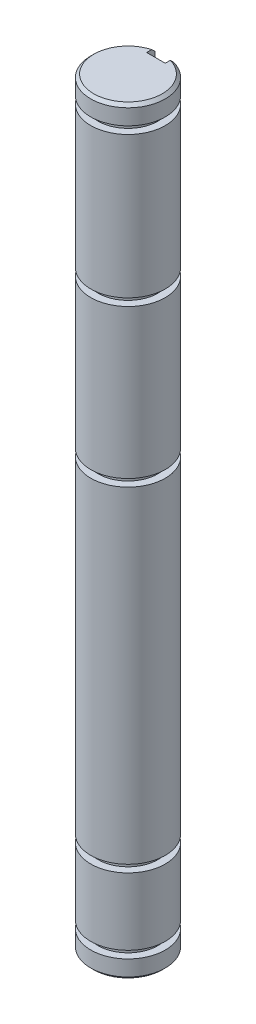
ISO-10303-21;
HEADER;
FILE_DESCRIPTION(('STEP AP214'),'2;1');
FILE_NAME('part.step','',(''),(''),'','','');
FILE_SCHEMA(('AUTOMOTIVE_DESIGN { 1 0 10303 214 1 1 1 1 }'));
ENDSEC;
DATA;
#1=APPLICATION_CONTEXT('core data for automotive mechanical design processes');
#2=APPLICATION_PROTOCOL_DEFINITION('international standard','automotive_design',2000,#1);
#3=PRODUCT_CONTEXT('',#1,'mechanical');
#4=PRODUCT('Part','Part','',(#3));
#5=PRODUCT_RELATED_PRODUCT_CATEGORY('part','',(#4));
#6=PRODUCT_DEFINITION_FORMATION('','',#4);
#7=PRODUCT_DEFINITION_CONTEXT('part definition',#1,'design');
#8=PRODUCT_DEFINITION('design','',#6,#7);
#9=PRODUCT_DEFINITION_SHAPE('','',#8);
#10=(LENGTH_UNIT() NAMED_UNIT(*) SI_UNIT(.MILLI.,.METRE.));
#11=(NAMED_UNIT(*) PLANE_ANGLE_UNIT() SI_UNIT($,.RADIAN.));
#12=(NAMED_UNIT(*) SI_UNIT($,.STERADIAN.) SOLID_ANGLE_UNIT());
#13=UNCERTAINTY_MEASURE_WITH_UNIT(LENGTH_MEASURE(1.E-05),#10,'distance_accuracy_value','');
#14=(GEOMETRIC_REPRESENTATION_CONTEXT(3) GLOBAL_UNCERTAINTY_ASSIGNED_CONTEXT((#13)) GLOBAL_UNIT_ASSIGNED_CONTEXT((#10,
#11,#12)) REPRESENTATION_CONTEXT('',''));
#15=CARTESIAN_POINT('',(0.,0.,0.));
#16=DIRECTION('',(0.,0.,1.));
#17=DIRECTION('',(1.,0.,0.));
#18=AXIS2_PLACEMENT_3D('',#15,#16,#17);
#19=CARTESIAN_POINT('',(5.842,-64.67475,0.));
#20=DIRECTION('',(0.,-1.,0.));
#21=DIRECTION('',(1.,0.,0.));
#22=AXIS2_PLACEMENT_3D('',#19,#20,#21);
#23=PLANE('',#22);
#24=DIRECTION('',(0.,0.,1.));
#25=VECTOR('',#24,1.);
#26=CARTESIAN_POINT('',(-1.58749999999999,-64.67475,-6.35000000000003));
#27=LINE('',#26,#25);
#28=CARTESIAN_POINT('',(-1.58749999999999,-64.67475,-5.62217108864538));
#29=VERTEX_POINT('',#28);
#30=CARTESIAN_POINT('',(-1.58749999999999,-64.67475,-4.7625));
#31=VERTEX_POINT('',#30);
#32=EDGE_CURVE('E202',#29,#31,#27,.T.);
#33=ORIENTED_EDGE('',*,*,#32,.T.);
#34=DIRECTION('',(1.,0.,0.));
#35=VECTOR('',#34,1.);
#36=CARTESIAN_POINT('',(-1.58749999999999,-64.67475,-4.7625));
#37=LINE('',#36,#35);
#38=CARTESIAN_POINT('',(1.58750000000001,-64.67475,-4.7625));
#39=VERTEX_POINT('',#38);
#40=EDGE_CURVE('E209',#31,#39,#37,.T.);
#41=ORIENTED_EDGE('',*,*,#40,.T.);
#42=DIRECTION('',(0.,0.,-1.));
#43=VECTOR('',#42,1.);
#44=CARTESIAN_POINT('',(1.58750000000001,-64.67475,-6.35000000000003));
#45=LINE('',#44,#43);
#46=CARTESIAN_POINT('',(1.58750000000001,-64.67475,-5.62217108864538));
#47=VERTEX_POINT('',#46);
#48=EDGE_CURVE('E206',#39,#47,#45,.T.);
#49=ORIENTED_EDGE('',*,*,#48,.T.);
#50=CARTESIAN_POINT('',(0.,-64.67475,0.));
#51=DIRECTION('',(0.,-1.,0.));
#52=DIRECTION('',(1.,0.,0.));
#53=AXIS2_PLACEMENT_3D('',#50,#51,#52);
#54=CIRCLE('',#53,5.842);
#55=EDGE_CURVE('E38',#47,#29,#54,.T.);
#56=ORIENTED_EDGE('',*,*,#55,.T.);
#57=EDGE_LOOP('',(#33,#41,#49,#56));
#58=FACE_BOUND('',#57,.T.);
#59=ADVANCED_FACE('F31',(#58),#23,.T.);
#60=CARTESIAN_POINT('',(0.,-64.67475,0.));
#61=DIRECTION('',(0.,1.,0.));
#62=DIRECTION('',(-1.,0.,0.));
#63=AXIS2_PLACEMENT_3D('',#60,#61,#62);
#64=CONICAL_SURFACE('',#63,5.842,0.785398163397453);
#65=CARTESIAN_POINT('',(-1.58749999999999,-66.5159164714446,-3.67239876282701));
#66=CARTESIAN_POINT('',(-1.58749999999999,-66.4246513991528,-3.77181677234084));
#67=CARTESIAN_POINT('',(-1.58749999999999,-66.3330799616119,-3.87095234673042));
#68=CARTESIAN_POINT('',(-1.58749999999999,-66.1494272596856,-4.06874868677541));
#69=CARTESIAN_POINT('',(-1.58749999999999,-66.0573459997312,-4.16740945654362));
#70=CARTESIAN_POINT('',(-1.58749999999999,-65.7804946273054,-4.462811708334));
#71=CARTESIAN_POINT('',(-1.58749999999999,-65.5951117946115,-4.65897869590318));
#72=CARTESIAN_POINT('',(-1.58749999999999,-65.2232332159025,-5.05023169740127));
#73=CARTESIAN_POINT('',(-1.58749999999999,-65.0367375335119,-5.24531777192192));
#74=CARTESIAN_POINT('',(-1.58749999999999,-64.6629334141287,-5.63471237461713));
#75=CARTESIAN_POINT('',(-1.58749999999999,-64.4756249703489,-5.82902089627232));
#76=CARTESIAN_POINT('',(-1.58749999999999,-64.1004164073025,-6.21704278976413));
#77=CARTESIAN_POINT('',(-1.58749999999999,-63.9125163243729,-6.4107561967613));
#78=CARTESIAN_POINT('',(-1.58749999999999,-63.5362547877643,-6.79773478278618));
#79=CARTESIAN_POINT('',(-1.58749999999999,-63.3478933334406,-6.990999961187));
#80=CARTESIAN_POINT('',(-1.58749999999999,-62.9708008922909,-7.37719004225511));
#81=CARTESIAN_POINT('',(-1.5875,-62.7820698857708,-7.57011492568534));
#82=CARTESIAN_POINT('',(-1.5875,-62.4043187737384,-7.95568015341909));
#83=CARTESIAN_POINT('',(-1.5875,-62.2152986692484,-8.14832049872411));
#84=CARTESIAN_POINT('',(-1.5875,-62.0261684174548,-8.34085243604367));
#85=B_SPLINE_CURVE_WITH_KNOTS('',3,(#65,#66,#67,#68,#69,#70,#71,#72,#73,#74,#75,#76,#77,#78,#79,
#80,#81,#82,#83,#84),.UNSPECIFIED.,.F.,.F.,(4,2,2,2,2,2,2,2,2,4),(0.,0.404867518030814,
0.809731522731825,1.61943683574127,2.42909629109202,3.23876252084396,4.04837995670953,
4.85799852424495,5.66766148032732,6.47732157976927),.UNSPECIFIED.);
#86=CARTESIAN_POINT('',(-1.58749999999999,-64.16675,-6.14836106210428));
#87=VERTEX_POINT('',#86);
#88=EDGE_CURVE('E52',#29,#87,#85,.T.);
#89=ORIENTED_EDGE('',*,*,#88,.F.);
#90=ORIENTED_EDGE('',*,*,#55,.F.);
#91=CARTESIAN_POINT('',(1.58750000000001,-62.0261684174548,-8.34085243604367));
#92=CARTESIAN_POINT('',(1.5875,-62.2152986692484,-8.1483204987241));
#93=CARTESIAN_POINT('',(1.58750000000001,-62.4043187737384,-7.95568015341908));
#94=CARTESIAN_POINT('',(1.58750000000001,-62.7820698857708,-7.57011492568533));
#95=CARTESIAN_POINT('',(1.58750000000001,-62.9708008922909,-7.3771900422551));
#96=CARTESIAN_POINT('',(1.58750000000001,-63.3478933334406,-6.990999961187));
#97=CARTESIAN_POINT('',(1.58750000000001,-63.5362547877643,-6.79773478278619));
#98=CARTESIAN_POINT('',(1.58750000000001,-63.9125163243729,-6.41075619676129));
#99=CARTESIAN_POINT('',(1.58750000000001,-64.1004164073024,-6.21704278976411));
#100=CARTESIAN_POINT('',(1.58750000000001,-64.4756249703489,-5.82902089627229));
#101=CARTESIAN_POINT('',(1.58750000000001,-64.6629334141287,-5.63471237461712));
#102=CARTESIAN_POINT('',(1.58750000000001,-65.0367375335119,-5.24531777192192));
#103=CARTESIAN_POINT('',(1.58750000000001,-65.2232332159025,-5.05023169740127));
#104=CARTESIAN_POINT('',(1.58750000000001,-65.5951117946115,-4.65897869590317));
#105=CARTESIAN_POINT('',(1.58750000000001,-65.7804946273054,-4.46281170833399));
#106=CARTESIAN_POINT('',(1.58750000000001,-66.0573459997312,-4.16740945654361));
#107=CARTESIAN_POINT('',(1.58750000000001,-66.1494272596856,-4.0687486867754));
#108=CARTESIAN_POINT('',(1.58750000000001,-66.3330799616119,-3.87095234673041));
#109=CARTESIAN_POINT('',(1.58750000000001,-66.4246513991528,-3.77181677234083));
#110=CARTESIAN_POINT('',(1.58750000000001,-66.5159164714446,-3.672398762827));
#111=B_SPLINE_CURVE_WITH_KNOTS('',3,(#91,#92,#93,#94,#95,#96,#97,#98,#99,#100,#101,#102,#103,
#104,#105,#106,#107,#108,#109,#110),.UNSPECIFIED.,.F.,.F.,(4,2,2,2,2,2,2,2,2,4),(0.,
0.809660099441967,1.61932305552433,2.42894162305973,3.23855905892532,4.04822528867727,
4.85788474402801,5.66759005703746,6.07245406173847,6.47732157976928),.UNSPECIFIED.);
#112=CARTESIAN_POINT('',(1.58750000000001,-64.16675,-6.14836106210427));
#113=VERTEX_POINT('',#112);
#114=EDGE_CURVE('E246',#113,#47,#111,.T.);
#115=ORIENTED_EDGE('',*,*,#114,.F.);
#116=CARTESIAN_POINT('',(0.,-64.16675,0.));
#117=DIRECTION('',(0.,-1.,0.));
#118=DIRECTION('',(1.,0.,0.));
#119=AXIS2_PLACEMENT_3D('',#116,#117,#118);
#120=CIRCLE('',#119,6.35);
#121=EDGE_CURVE('E609',#113,#87,#120,.T.);
#122=ORIENTED_EDGE('',*,*,#121,.T.);
#123=EDGE_LOOP('',(#89,#90,#115,#122));
#124=FACE_BOUND('',#123,.T.);
#125=ADVANCED_FACE('F259',(#124),#64,.T.);
#126=CARTESIAN_POINT('',(0.,-64.67475,0.));
#127=DIRECTION('',(0.,-1.,0.));
#128=DIRECTION('',(1.,0.,0.));
#129=AXIS2_PLACEMENT_3D('',#126,#127,#128);
#130=CYLINDRICAL_SURFACE('',#129,6.35);
#131=DIRECTION('',(0.,-1.,0.));
#132=VECTOR('',#131,1.);
#133=CARTESIAN_POINT('',(-1.58749999999999,-64.67475,-6.14836106210428));
#134=LINE('',#133,#132);
#135=CARTESIAN_POINT('',(-1.58749999999999,-61.49975,-6.14836106210428));
#136=VERTEX_POINT('',#135);
#137=EDGE_CURVE('E274',#87,#136,#134,.F.);
#138=ORIENTED_EDGE('',*,*,#137,.F.);
#139=ORIENTED_EDGE('',*,*,#121,.F.);
#140=DIRECTION('',(0.,-1.,0.));
#141=VECTOR('',#140,1.);
#142=CARTESIAN_POINT('',(1.58750000000001,-64.67475,-6.14836106210427));
#143=LINE('',#142,#141);
#144=CARTESIAN_POINT('',(1.5875,-61.49975,-6.14836106210427));
#145=VERTEX_POINT('',#144);
#146=EDGE_CURVE('E253',#145,#113,#143,.T.);
#147=ORIENTED_EDGE('',*,*,#146,.F.);
#148=CARTESIAN_POINT('',(0.,-61.49975,0.));
#149=DIRECTION('',(0.,-1.,0.));
#150=DIRECTION('',(1.,0.,0.));
#151=AXIS2_PLACEMENT_3D('',#148,#149,#150);
#152=CIRCLE('',#151,6.35);
#153=EDGE_CURVE('E606',#145,#136,#152,.T.);
#154=ORIENTED_EDGE('',*,*,#153,.T.);
#155=EDGE_LOOP('',(#138,#139,#147,#154));
#156=FACE_BOUND('',#155,.T.);
#157=ADVANCED_FACE('F263',(#156),#130,.T.);
#158=CARTESIAN_POINT('',(6.34999999999999,-61.49975,0.));
#159=DIRECTION('',(0.,1.,0.));
#160=DIRECTION('',(-1.,0.,0.));
#161=AXIS2_PLACEMENT_3D('',#158,#159,#160);
#162=PLANE('',#161);
#163=DIRECTION('',(0.,0.,1.));
#164=VECTOR('',#163,1.);
#165=CARTESIAN_POINT('',(-1.58749999999999,-61.49975,0.));
#166=LINE('',#165,#164);
#167=CARTESIAN_POINT('',(-1.5875,-61.49975,-4.82558221875857));
#168=VERTEX_POINT('',#167);
#169=EDGE_CURVE('E616',#136,#168,#166,.T.);
#170=ORIENTED_EDGE('',*,*,#169,.F.);
#171=ORIENTED_EDGE('',*,*,#153,.F.);
#172=DIRECTION('',(0.,0.,-1.));
#173=VECTOR('',#172,1.);
#174=CARTESIAN_POINT('',(1.5875,-61.49975,0.));
#175=LINE('',#174,#173);
#176=CARTESIAN_POINT('',(1.5875,-61.49975,-4.82558221875856));
#177=VERTEX_POINT('',#176);
#178=EDGE_CURVE('E694',#177,#145,#175,.T.);
#179=ORIENTED_EDGE('',*,*,#178,.F.);
#180=CARTESIAN_POINT('',(0.,-61.49975,0.));
#181=DIRECTION('',(0.,-1.,0.));
#182=DIRECTION('',(1.,0.,0.));
#183=AXIS2_PLACEMENT_3D('',#180,#181,#182);
#184=CIRCLE('',#183,5.07999999999988);
#185=EDGE_CURVE('E603',#177,#168,#184,.T.);
#186=ORIENTED_EDGE('',*,*,#185,.T.);
#187=EDGE_LOOP('',(#170,#171,#179,#186));
#188=FACE_BOUND('',#187,.T.);
#189=ADVANCED_FACE('F301',(#188),#162,.T.);
#190=CARTESIAN_POINT('',(0.,-64.67475,0.));
#191=DIRECTION('',(0.,-1.,0.));
#192=DIRECTION('',(1.,0.,0.));
#193=AXIS2_PLACEMENT_3D('',#190,#191,#192);
#194=CYLINDRICAL_SURFACE('',#193,5.07999999999988);
#195=DIRECTION('',(0.,-1.,0.));
#196=VECTOR('',#195,1.);
#197=CARTESIAN_POINT('',(-1.58749999999999,-64.67475,-4.82558221875857));
#198=LINE('',#197,#196);
#199=CARTESIAN_POINT('',(-1.58749999999999,-60.22975,-4.82558221875857));
#200=VERTEX_POINT('',#199);
#201=EDGE_CURVE('E617',#168,#200,#198,.F.);
#202=ORIENTED_EDGE('',*,*,#201,.F.);
#203=ORIENTED_EDGE('',*,*,#185,.F.);
#204=DIRECTION('',(0.,-1.,0.));
#205=VECTOR('',#204,1.);
#206=CARTESIAN_POINT('',(1.58750000000001,-64.67475,-4.82558221875856));
#207=LINE('',#206,#205);
#208=CARTESIAN_POINT('',(1.5875,-60.22975,-4.82558221875856));
#209=VERTEX_POINT('',#208);
#210=EDGE_CURVE('E693',#209,#177,#207,.T.);
#211=ORIENTED_EDGE('',*,*,#210,.F.);
#212=CARTESIAN_POINT('',(0.,-60.22975,0.));
#213=DIRECTION('',(0.,-1.,0.));
#214=DIRECTION('',(1.,0.,0.));
#215=AXIS2_PLACEMENT_3D('',#212,#213,#214);
#216=CIRCLE('',#215,5.07999999999988);
#217=EDGE_CURVE('E600',#209,#200,#216,.T.);
#218=ORIENTED_EDGE('',*,*,#217,.T.);
#219=EDGE_LOOP('',(#202,#203,#211,#218));
#220=FACE_BOUND('',#219,.T.);
#221=ADVANCED_FACE('F308',(#220),#194,.T.);
#222=CARTESIAN_POINT('',(6.34999999999999,-60.22975,0.));
#223=DIRECTION('',(0.,-1.,0.));
#224=DIRECTION('',(1.,0.,0.));
#225=AXIS2_PLACEMENT_3D('',#222,#223,#224);
#226=PLANE('',#225);
#227=DIRECTION('',(0.,0.,-1.));
#228=VECTOR('',#227,1.);
#229=CARTESIAN_POINT('',(-1.58749999999999,-60.22975,0.));
#230=LINE('',#229,#228);
#231=CARTESIAN_POINT('',(-1.5875,-60.22975,-6.14836106210428));
#232=VERTEX_POINT('',#231);
#233=EDGE_CURVE('E619',#200,#232,#230,.T.);
#234=ORIENTED_EDGE('',*,*,#233,.F.);
#235=ORIENTED_EDGE('',*,*,#217,.F.);
#236=DIRECTION('',(0.,0.,1.));
#237=VECTOR('',#236,1.);
#238=CARTESIAN_POINT('',(1.5875,-60.22975,0.));
#239=LINE('',#238,#237);
#240=CARTESIAN_POINT('',(1.5875,-60.22975,-6.14836106210427));
#241=VERTEX_POINT('',#240);
#242=EDGE_CURVE('E691',#241,#209,#239,.T.);
#243=ORIENTED_EDGE('',*,*,#242,.F.);
#244=CARTESIAN_POINT('',(0.,-60.22975,0.));
#245=DIRECTION('',(0.,-1.,0.));
#246=DIRECTION('',(1.,0.,0.));
#247=AXIS2_PLACEMENT_3D('',#244,#245,#246);
#248=CIRCLE('',#247,6.35);
#249=EDGE_CURVE('E597',#241,#232,#248,.T.);
#250=ORIENTED_EDGE('',*,*,#249,.T.);
#251=EDGE_LOOP('',(#234,#235,#243,#250));
#252=FACE_BOUND('',#251,.T.);
#253=ADVANCED_FACE('F315',(#252),#226,.T.);
#254=CARTESIAN_POINT('',(0.,-64.67475,0.));
#255=DIRECTION('',(0.,-1.,0.));
#256=DIRECTION('',(1.,0.,0.));
#257=AXIS2_PLACEMENT_3D('',#254,#255,#256);
#258=CYLINDRICAL_SURFACE('',#257,6.35);
#259=DIRECTION('',(0.,-1.,0.));
#260=VECTOR('',#259,1.);
#261=CARTESIAN_POINT('',(-1.58749999999999,-64.67475,-6.14836106210428));
#262=LINE('',#261,#260);
#263=CARTESIAN_POINT('',(-1.5875,-48.79975,-6.14836106210428));
#264=VERTEX_POINT('',#263);
#265=EDGE_CURVE('E623',#232,#264,#262,.F.);
#266=ORIENTED_EDGE('',*,*,#265,.F.);
#267=ORIENTED_EDGE('',*,*,#249,.F.);
#268=DIRECTION('',(0.,-1.,0.));
#269=VECTOR('',#268,1.);
#270=CARTESIAN_POINT('',(1.58750000000001,-64.67475,-6.14836106210427));
#271=LINE('',#270,#269);
#272=CARTESIAN_POINT('',(1.5875,-48.79975,-6.14836106210428));
#273=VERTEX_POINT('',#272);
#274=EDGE_CURVE('E689',#273,#241,#271,.T.);
#275=ORIENTED_EDGE('',*,*,#274,.F.);
#276=CARTESIAN_POINT('',(0.,-48.79975,0.));
#277=DIRECTION('',(0.,-1.,0.));
#278=DIRECTION('',(1.,0.,0.));
#279=AXIS2_PLACEMENT_3D('',#276,#277,#278);
#280=CIRCLE('',#279,6.35);
#281=EDGE_CURVE('E594',#273,#264,#280,.T.);
#282=ORIENTED_EDGE('',*,*,#281,.T.);
#283=EDGE_LOOP('',(#266,#267,#275,#282));
#284=FACE_BOUND('',#283,.T.);
#285=ADVANCED_FACE('F323',(#284),#258,.T.);
#286=CARTESIAN_POINT('',(6.34999999999999,-48.79975,0.));
#287=DIRECTION('',(0.,1.,0.));
#288=DIRECTION('',(-1.,0.,0.));
#289=AXIS2_PLACEMENT_3D('',#286,#287,#288);
#290=PLANE('',#289);
#291=DIRECTION('',(0.,0.,1.));
#292=VECTOR('',#291,1.);
#293=CARTESIAN_POINT('',(-1.5875,-48.79975,0.));
#294=LINE('',#293,#292);
#295=CARTESIAN_POINT('',(-1.5875,-48.79975,-4.82558221875859));
#296=VERTEX_POINT('',#295);
#297=EDGE_CURVE('E625',#264,#296,#294,.T.);
#298=ORIENTED_EDGE('',*,*,#297,.F.);
#299=ORIENTED_EDGE('',*,*,#281,.F.);
#300=DIRECTION('',(0.,0.,-1.));
#301=VECTOR('',#300,1.);
#302=CARTESIAN_POINT('',(1.5875,-48.79975,0.));
#303=LINE('',#302,#301);
#304=CARTESIAN_POINT('',(1.5875,-48.79975,-4.82558221875859));
#305=VERTEX_POINT('',#304);
#306=EDGE_CURVE('E687',#305,#273,#303,.T.);
#307=ORIENTED_EDGE('',*,*,#306,.F.);
#308=CARTESIAN_POINT('',(0.,-48.79975,0.));
#309=DIRECTION('',(0.,-1.,0.));
#310=DIRECTION('',(1.,0.,0.));
#311=AXIS2_PLACEMENT_3D('',#308,#309,#310);
#312=CIRCLE('',#311,5.07999999999991);
#313=EDGE_CURVE('E591',#305,#296,#312,.T.);
#314=ORIENTED_EDGE('',*,*,#313,.T.);
#315=EDGE_LOOP('',(#298,#299,#307,#314));
#316=FACE_BOUND('',#315,.T.);
#317=ADVANCED_FACE('F331',(#316),#290,.T.);
#318=CARTESIAN_POINT('',(0.,-64.67475,0.));
#319=DIRECTION('',(0.,-1.,0.));
#320=DIRECTION('',(1.,0.,0.));
#321=AXIS2_PLACEMENT_3D('',#318,#319,#320);
#322=CYLINDRICAL_SURFACE('',#321,5.07999999999991);
#323=DIRECTION('',(0.,-1.,0.));
#324=VECTOR('',#323,1.);
#325=CARTESIAN_POINT('',(-1.58749999999999,-64.67475,-4.82558221875859));
#326=LINE('',#325,#324);
#327=CARTESIAN_POINT('',(-1.5875,-47.52975,-4.82558221875859));
#328=VERTEX_POINT('',#327);
#329=EDGE_CURVE('E627',#296,#328,#326,.F.);
#330=ORIENTED_EDGE('',*,*,#329,.F.);
#331=ORIENTED_EDGE('',*,*,#313,.F.);
#332=DIRECTION('',(0.,-1.,0.));
#333=VECTOR('',#332,1.);
#334=CARTESIAN_POINT('',(1.58750000000001,-64.67475,-4.82558221875859));
#335=LINE('',#334,#333);
#336=CARTESIAN_POINT('',(1.5875,-47.52975,-4.82558221875858));
#337=VERTEX_POINT('',#336);
#338=EDGE_CURVE('E685',#337,#305,#335,.T.);
#339=ORIENTED_EDGE('',*,*,#338,.F.);
#340=CARTESIAN_POINT('',(0.,-47.52975,0.));
#341=DIRECTION('',(0.,-1.,0.));
#342=DIRECTION('',(1.,0.,0.));
#343=AXIS2_PLACEMENT_3D('',#340,#341,#342);
#344=CIRCLE('',#343,5.07999999999991);
#345=EDGE_CURVE('E588',#337,#328,#344,.T.);
#346=ORIENTED_EDGE('',*,*,#345,.T.);
#347=EDGE_LOOP('',(#330,#331,#339,#346));
#348=FACE_BOUND('',#347,.T.);
#349=ADVANCED_FACE('F339',(#348),#322,.T.);
#350=CARTESIAN_POINT('',(6.34999999999999,-47.52975,0.));
#351=DIRECTION('',(0.,-1.,0.));
#352=DIRECTION('',(1.,0.,0.));
#353=AXIS2_PLACEMENT_3D('',#350,#351,#352);
#354=PLANE('',#353);
#355=DIRECTION('',(0.,0.,-1.));
#356=VECTOR('',#355,1.);
#357=CARTESIAN_POINT('',(-1.5875,-47.52975,0.));
#358=LINE('',#357,#356);
#359=CARTESIAN_POINT('',(-1.5875,-47.52975,-6.14836106210429));
#360=VERTEX_POINT('',#359);
#361=EDGE_CURVE('E629',#328,#360,#358,.T.);
#362=ORIENTED_EDGE('',*,*,#361,.F.);
#363=ORIENTED_EDGE('',*,*,#345,.F.);
#364=DIRECTION('',(0.,0.,1.));
#365=VECTOR('',#364,1.);
#366=CARTESIAN_POINT('',(1.5875,-47.52975,0.));
#367=LINE('',#366,#365);
#368=CARTESIAN_POINT('',(1.5875,-47.52975,-6.14836106210428));
#369=VERTEX_POINT('',#368);
#370=EDGE_CURVE('E683',#369,#337,#367,.T.);
#371=ORIENTED_EDGE('',*,*,#370,.F.);
#372=CARTESIAN_POINT('',(0.,-47.52975,0.));
#373=DIRECTION('',(0.,-1.,0.));
#374=DIRECTION('',(1.,0.,0.));
#375=AXIS2_PLACEMENT_3D('',#372,#373,#374);
#376=CIRCLE('',#375,6.35);
#377=EDGE_CURVE('E585',#369,#360,#376,.T.);
#378=ORIENTED_EDGE('',*,*,#377,.T.);
#379=EDGE_LOOP('',(#362,#363,#371,#378));
#380=FACE_BOUND('',#379,.T.);
#381=ADVANCED_FACE('F347',(#380),#354,.T.);
#382=CARTESIAN_POINT('',(0.,-64.67475,0.));
#383=DIRECTION('',(0.,-1.,0.));
#384=DIRECTION('',(1.,0.,0.));
#385=AXIS2_PLACEMENT_3D('',#382,#383,#384);
#386=CYLINDRICAL_SURFACE('',#385,6.35000000000001);
#387=DIRECTION('',(0.,-1.,0.));
#388=VECTOR('',#387,1.);
#389=CARTESIAN_POINT('',(-1.58749999999999,-64.67475,-6.14836106210429));
#390=LINE('',#389,#388);
#391=CARTESIAN_POINT('',(-1.58750000000001,8.15975000000001,-6.1483610621043));
#392=VERTEX_POINT('',#391);
#393=EDGE_CURVE('E631',#360,#392,#390,.F.);
#394=ORIENTED_EDGE('',*,*,#393,.F.);
#395=ORIENTED_EDGE('',*,*,#377,.F.);
#396=DIRECTION('',(0.,-1.,0.));
#397=VECTOR('',#396,1.);
#398=CARTESIAN_POINT('',(1.58750000000001,-64.67475,-6.14836106210428));
#399=LINE('',#398,#397);
#400=CARTESIAN_POINT('',(1.58749999999999,8.15975000000001,-6.14836106210429));
#401=VERTEX_POINT('',#400);
#402=EDGE_CURVE('E681',#401,#369,#399,.T.);
#403=ORIENTED_EDGE('',*,*,#402,.F.);
#404=CARTESIAN_POINT('',(0.,8.15975000000001,0.));
#405=DIRECTION('',(0.,-1.,0.));
#406=DIRECTION('',(1.,0.,0.));
#407=AXIS2_PLACEMENT_3D('',#404,#405,#406);
#408=CIRCLE('',#407,6.35000000000002);
#409=EDGE_CURVE('E582',#401,#392,#408,.T.);
#410=ORIENTED_EDGE('',*,*,#409,.T.);
#411=EDGE_LOOP('',(#394,#395,#403,#410));
#412=FACE_BOUND('',#411,.T.);
#413=ADVANCED_FACE('F355',(#412),#386,.T.);
#414=CARTESIAN_POINT('',(6.35,8.15975000000001,0.));
#415=DIRECTION('',(0.,1.,0.));
#416=DIRECTION('',(-1.,0.,0.));
#417=AXIS2_PLACEMENT_3D('',#414,#415,#416);
#418=PLANE('',#417);
#419=DIRECTION('',(0.,0.,1.));
#420=VECTOR('',#419,1.);
#421=CARTESIAN_POINT('',(-1.58750000000001,8.15975000000001,0.));
#422=LINE('',#421,#420);
#423=CARTESIAN_POINT('',(-1.58750000000001,8.15975000000001,-4.8255822187586));
#424=VERTEX_POINT('',#423);
#425=EDGE_CURVE('E633',#392,#424,#422,.T.);
#426=ORIENTED_EDGE('',*,*,#425,.F.);
#427=ORIENTED_EDGE('',*,*,#409,.F.);
#428=DIRECTION('',(0.,0.,-1.));
#429=VECTOR('',#428,1.);
#430=CARTESIAN_POINT('',(1.58749999999999,8.15975000000001,0.));
#431=LINE('',#430,#429);
#432=CARTESIAN_POINT('',(1.58749999999999,8.15975000000001,-4.82558221875859));
#433=VERTEX_POINT('',#432);
#434=EDGE_CURVE('E679',#433,#401,#431,.T.);
#435=ORIENTED_EDGE('',*,*,#434,.F.);
#436=CARTESIAN_POINT('',(0.,8.15975000000001,0.));
#437=DIRECTION('',(0.,-1.,0.));
#438=DIRECTION('',(1.,0.,0.));
#439=AXIS2_PLACEMENT_3D('',#436,#437,#438);
#440=CIRCLE('',#439,5.07999999999992);
#441=EDGE_CURVE('E579',#433,#424,#440,.T.);
#442=ORIENTED_EDGE('',*,*,#441,.T.);
#443=EDGE_LOOP('',(#426,#427,#435,#442));
#444=FACE_BOUND('',#443,.T.);
#445=ADVANCED_FACE('F363',(#444),#418,.T.);
#446=CARTESIAN_POINT('',(0.,-64.67475,0.));
#447=DIRECTION('',(0.,-1.,0.));
#448=DIRECTION('',(1.,0.,0.));
#449=AXIS2_PLACEMENT_3D('',#446,#447,#448);
#450=CYLINDRICAL_SURFACE('',#449,5.07999999999991);
#451=DIRECTION('',(0.,-1.,0.));
#452=VECTOR('',#451,1.);
#453=CARTESIAN_POINT('',(-1.58749999999999,-64.67475,-4.8255822187586));
#454=LINE('',#453,#452);
#455=CARTESIAN_POINT('',(-1.58750000000001,9.42975000000001,-4.8255822187586));
#456=VERTEX_POINT('',#455);
#457=EDGE_CURVE('E635',#424,#456,#454,.F.);
#458=ORIENTED_EDGE('',*,*,#457,.F.);
#459=ORIENTED_EDGE('',*,*,#441,.F.);
#460=DIRECTION('',(0.,-1.,0.));
#461=VECTOR('',#460,1.);
#462=CARTESIAN_POINT('',(1.58750000000001,-64.67475,-4.82558221875859));
#463=LINE('',#462,#461);
#464=CARTESIAN_POINT('',(1.58749999999999,9.42975000000001,-4.82558221875859));
#465=VERTEX_POINT('',#464);
#466=EDGE_CURVE('E677',#465,#433,#463,.T.);
#467=ORIENTED_EDGE('',*,*,#466,.F.);
#468=CARTESIAN_POINT('',(0.,9.42975000000001,0.));
#469=DIRECTION('',(0.,-1.,0.));
#470=DIRECTION('',(1.,0.,0.));
#471=AXIS2_PLACEMENT_3D('',#468,#469,#470);
#472=CIRCLE('',#471,5.07999999999992);
#473=EDGE_CURVE('E576',#465,#456,#472,.T.);
#474=ORIENTED_EDGE('',*,*,#473,.T.);
#475=EDGE_LOOP('',(#458,#459,#467,#474));
#476=FACE_BOUND('',#475,.T.);
#477=ADVANCED_FACE('F371',(#476),#450,.T.);
#478=CARTESIAN_POINT('',(6.35,9.42975000000001,0.));
#479=DIRECTION('',(0.,-1.,0.));
#480=DIRECTION('',(1.,0.,0.));
#481=AXIS2_PLACEMENT_3D('',#478,#479,#480);
#482=PLANE('',#481);
#483=DIRECTION('',(0.,0.,-1.));
#484=VECTOR('',#483,1.);
#485=CARTESIAN_POINT('',(-1.58750000000001,9.42975000000001,0.));
#486=LINE('',#485,#484);
#487=CARTESIAN_POINT('',(-1.58750000000001,9.42975000000001,-6.1483610621043));
#488=VERTEX_POINT('',#487);
#489=EDGE_CURVE('E637',#456,#488,#486,.T.);
#490=ORIENTED_EDGE('',*,*,#489,.F.);
#491=ORIENTED_EDGE('',*,*,#473,.F.);
#492=DIRECTION('',(0.,0.,1.));
#493=VECTOR('',#492,1.);
#494=CARTESIAN_POINT('',(1.58749999999999,9.42975000000001,0.));
#495=LINE('',#494,#493);
#496=CARTESIAN_POINT('',(1.58749999999999,9.42975000000001,-6.1483610621043));
#497=VERTEX_POINT('',#496);
#498=EDGE_CURVE('E675',#497,#465,#495,.T.);
#499=ORIENTED_EDGE('',*,*,#498,.F.);
#500=CARTESIAN_POINT('',(0.,9.42975000000001,0.));
#501=DIRECTION('',(0.,-1.,0.));
#502=DIRECTION('',(1.,0.,0.));
#503=AXIS2_PLACEMENT_3D('',#500,#501,#502);
#504=CIRCLE('',#503,6.35000000000002);
#505=EDGE_CURVE('E573',#497,#488,#504,.T.);
#506=ORIENTED_EDGE('',*,*,#505,.T.);
#507=EDGE_LOOP('',(#490,#491,#499,#506));
#508=FACE_BOUND('',#507,.T.);
#509=ADVANCED_FACE('F379',(#508),#482,.T.);
#510=CARTESIAN_POINT('',(0.,-64.67475,0.));
#511=DIRECTION('',(0.,-1.,0.));
#512=DIRECTION('',(1.,0.,0.));
#513=AXIS2_PLACEMENT_3D('',#510,#511,#512);
#514=CYLINDRICAL_SURFACE('',#513,6.35000000000003);
#515=DIRECTION('',(0.,-1.,0.));
#516=VECTOR('',#515,1.);
#517=CARTESIAN_POINT('',(-1.58749999999999,-64.67475,-6.1483610621043));
#518=LINE('',#517,#516);
#519=CARTESIAN_POINT('',(-1.58750000000001,34.82975,-6.14836106210431));
#520=VERTEX_POINT('',#519);
#521=EDGE_CURVE('E639',#488,#520,#518,.F.);
#522=ORIENTED_EDGE('',*,*,#521,.F.);
#523=ORIENTED_EDGE('',*,*,#505,.F.);
#524=DIRECTION('',(0.,-1.,0.));
#525=VECTOR('',#524,1.);
#526=CARTESIAN_POINT('',(1.58750000000001,-64.67475,-6.1483610621043));
#527=LINE('',#526,#525);
#528=CARTESIAN_POINT('',(1.58749999999999,34.82975,-6.1483610621043));
#529=VERTEX_POINT('',#528);
#530=EDGE_CURVE('E673',#529,#497,#527,.T.);
#531=ORIENTED_EDGE('',*,*,#530,.F.);
#532=CARTESIAN_POINT('',(0.,34.82975,0.));
#533=DIRECTION('',(0.,-1.,0.));
#534=DIRECTION('',(1.,0.,0.));
#535=AXIS2_PLACEMENT_3D('',#532,#533,#534);
#536=CIRCLE('',#535,6.35000000000003);
#537=EDGE_CURVE('E570',#529,#520,#536,.T.);
#538=ORIENTED_EDGE('',*,*,#537,.T.);
#539=EDGE_LOOP('',(#522,#523,#531,#538));
#540=FACE_BOUND('',#539,.T.);
#541=ADVANCED_FACE('F387',(#540),#514,.T.);
#542=CARTESIAN_POINT('',(6.35,34.82975,0.));
#543=DIRECTION('',(0.,1.,0.));
#544=DIRECTION('',(-1.,0.,0.));
#545=AXIS2_PLACEMENT_3D('',#542,#543,#544);
#546=PLANE('',#545);
#547=DIRECTION('',(0.,0.,1.));
#548=VECTOR('',#547,1.);
#549=CARTESIAN_POINT('',(-1.58750000000001,34.82975,0.));
#550=LINE('',#549,#548);
#551=CARTESIAN_POINT('',(-1.58750000000002,34.82975,-4.8255822187586));
#552=VERTEX_POINT('',#551);
#553=EDGE_CURVE('E641',#520,#552,#550,.T.);
#554=ORIENTED_EDGE('',*,*,#553,.F.);
#555=ORIENTED_EDGE('',*,*,#537,.F.);
#556=DIRECTION('',(0.,0.,-1.));
#557=VECTOR('',#556,1.);
#558=CARTESIAN_POINT('',(1.58749999999999,34.82975,0.));
#559=LINE('',#558,#557);
#560=CARTESIAN_POINT('',(1.58749999999998,34.82975,-4.8255822187586));
#561=VERTEX_POINT('',#560);
#562=EDGE_CURVE('E671',#561,#529,#559,.T.);
#563=ORIENTED_EDGE('',*,*,#562,.F.);
#564=CARTESIAN_POINT('',(0.,34.82975,0.));
#565=DIRECTION('',(0.,-1.,0.));
#566=DIRECTION('',(1.,0.,0.));
#567=AXIS2_PLACEMENT_3D('',#564,#565,#566);
#568=CIRCLE('',#567,5.07999999999992);
#569=EDGE_CURVE('E567',#561,#552,#568,.T.);
#570=ORIENTED_EDGE('',*,*,#569,.T.);
#571=EDGE_LOOP('',(#554,#555,#563,#570));
#572=FACE_BOUND('',#571,.T.);
#573=ADVANCED_FACE('F395',(#572),#546,.T.);
#574=CARTESIAN_POINT('',(0.,-64.67475,0.));
#575=DIRECTION('',(0.,-1.,0.));
#576=DIRECTION('',(1.,0.,0.));
#577=AXIS2_PLACEMENT_3D('',#574,#575,#576);
#578=CYLINDRICAL_SURFACE('',#577,5.07999999999992);
#579=DIRECTION('',(0.,-1.,0.));
#580=VECTOR('',#579,1.);
#581=CARTESIAN_POINT('',(-1.58749999999999,-64.67475,-4.8255822187586));
#582=LINE('',#581,#580);
#583=CARTESIAN_POINT('',(-1.58750000000001,36.09975,-4.82558221875861));
#584=VERTEX_POINT('',#583);
#585=EDGE_CURVE('E643',#552,#584,#582,.F.);
#586=ORIENTED_EDGE('',*,*,#585,.F.);
#587=ORIENTED_EDGE('',*,*,#569,.F.);
#588=DIRECTION('',(0.,-1.,0.));
#589=VECTOR('',#588,1.);
#590=CARTESIAN_POINT('',(1.58750000000001,-64.67475,-4.8255822187586));
#591=LINE('',#590,#589);
#592=CARTESIAN_POINT('',(1.58749999999999,36.09975,-4.8255822187586));
#593=VERTEX_POINT('',#592);
#594=EDGE_CURVE('E669',#593,#561,#591,.T.);
#595=ORIENTED_EDGE('',*,*,#594,.F.);
#596=CARTESIAN_POINT('',(0.,36.09975,0.));
#597=DIRECTION('',(0.,-1.,0.));
#598=DIRECTION('',(1.,0.,0.));
#599=AXIS2_PLACEMENT_3D('',#596,#597,#598);
#600=CIRCLE('',#599,5.07999999999992);
#601=EDGE_CURVE('E564',#593,#584,#600,.T.);
#602=ORIENTED_EDGE('',*,*,#601,.T.);
#603=EDGE_LOOP('',(#586,#587,#595,#602));
#604=FACE_BOUND('',#603,.T.);
#605=ADVANCED_FACE('F403',(#604),#578,.T.);
#606=CARTESIAN_POINT('',(6.35,36.09975,0.));
#607=DIRECTION('',(0.,-1.,0.));
#608=DIRECTION('',(1.,0.,0.));
#609=AXIS2_PLACEMENT_3D('',#606,#607,#608);
#610=PLANE('',#609);
#611=DIRECTION('',(0.,0.,-1.));
#612=VECTOR('',#611,1.);
#613=CARTESIAN_POINT('',(-1.58750000000001,36.09975,0.));
#614=LINE('',#613,#612);
#615=CARTESIAN_POINT('',(-1.58750000000002,36.09975,-6.14836106210431));
#616=VERTEX_POINT('',#615);
#617=EDGE_CURVE('E645',#584,#616,#614,.T.);
#618=ORIENTED_EDGE('',*,*,#617,.F.);
#619=ORIENTED_EDGE('',*,*,#601,.F.);
#620=DIRECTION('',(0.,0.,1.));
#621=VECTOR('',#620,1.);
#622=CARTESIAN_POINT('',(1.58749999999999,36.09975,0.));
#623=LINE('',#622,#621);
#624=CARTESIAN_POINT('',(1.58749999999998,36.09975,-6.14836106210431));
#625=VERTEX_POINT('',#624);
#626=EDGE_CURVE('E664',#625,#593,#623,.T.);
#627=ORIENTED_EDGE('',*,*,#626,.F.);
#628=CARTESIAN_POINT('',(0.,36.09975,0.));
#629=DIRECTION('',(0.,-1.,0.));
#630=DIRECTION('',(1.,0.,0.));
#631=AXIS2_PLACEMENT_3D('',#628,#629,#630);
#632=CIRCLE('',#631,6.35000000000003);
#633=EDGE_CURVE('E561',#625,#616,#632,.T.);
#634=ORIENTED_EDGE('',*,*,#633,.T.);
#635=EDGE_LOOP('',(#618,#619,#627,#634));
#636=FACE_BOUND('',#635,.T.);
#637=ADVANCED_FACE('F411',(#636),#610,.T.);
#638=CARTESIAN_POINT('',(0.,-64.67475,0.));
#639=DIRECTION('',(0.,-1.,0.));
#640=DIRECTION('',(1.,0.,0.));
#641=AXIS2_PLACEMENT_3D('',#638,#639,#640);
#642=CYLINDRICAL_SURFACE('',#641,6.35000000000003);
#643=DIRECTION('',(0.,-1.,0.));
#644=VECTOR('',#643,1.);
#645=CARTESIAN_POINT('',(-1.58749999999999,-64.67475,-6.14836106210431));
#646=LINE('',#645,#644);
#647=CARTESIAN_POINT('',(-1.58750000000002,60.22975,-6.14836106210432));
#648=VERTEX_POINT('',#647);
#649=EDGE_CURVE('E647',#616,#648,#646,.F.);
#650=ORIENTED_EDGE('',*,*,#649,.F.);
#651=ORIENTED_EDGE('',*,*,#633,.F.);
#652=DIRECTION('',(0.,-1.,0.));
#653=VECTOR('',#652,1.);
#654=CARTESIAN_POINT('',(1.58750000000001,-64.67475,-6.14836106210431));
#655=LINE('',#654,#653);
#656=CARTESIAN_POINT('',(1.58749999999998,60.22975,-6.14836106210431));
#657=VERTEX_POINT('',#656);
#658=EDGE_CURVE('E661',#657,#625,#655,.T.);
#659=ORIENTED_EDGE('',*,*,#658,.F.);
#660=CARTESIAN_POINT('',(0.,60.22975,0.));
#661=DIRECTION('',(0.,-1.,0.));
#662=DIRECTION('',(1.,0.,0.));
#663=AXIS2_PLACEMENT_3D('',#660,#661,#662);
#664=CIRCLE('',#663,6.35000000000004);
#665=EDGE_CURVE('E558',#657,#648,#664,.T.);
#666=ORIENTED_EDGE('',*,*,#665,.T.);
#667=EDGE_LOOP('',(#650,#651,#659,#666));
#668=FACE_BOUND('',#667,.T.);
#669=ADVANCED_FACE('F419',(#668),#642,.T.);
#670=CARTESIAN_POINT('',(6.35,60.22975,0.));
#671=DIRECTION('',(0.,1.,0.));
#672=DIRECTION('',(-1.,0.,0.));
#673=AXIS2_PLACEMENT_3D('',#670,#671,#672);
#674=PLANE('',#673);
#675=DIRECTION('',(0.,0.,1.));
#676=VECTOR('',#675,1.);
#677=CARTESIAN_POINT('',(-1.58750000000002,60.22975,0.));
#678=LINE('',#677,#676);
#679=CARTESIAN_POINT('',(-1.58750000000003,60.22975,-4.82558221875862));
#680=VERTEX_POINT('',#679);
#681=EDGE_CURVE('E649',#648,#680,#678,.T.);
#682=ORIENTED_EDGE('',*,*,#681,.F.);
#683=ORIENTED_EDGE('',*,*,#665,.F.);
#684=DIRECTION('',(0.,0.,-1.));
#685=VECTOR('',#684,1.);
#686=CARTESIAN_POINT('',(1.58749999999998,60.22975,0.));
#687=LINE('',#686,#685);
#688=CARTESIAN_POINT('',(1.58749999999997,60.22975,-4.82558221875861));
#689=VERTEX_POINT('',#688);
#690=EDGE_CURVE('E659',#689,#657,#687,.T.);
#691=ORIENTED_EDGE('',*,*,#690,.F.);
#692=CARTESIAN_POINT('',(0.,60.22975,0.));
#693=DIRECTION('',(0.,-1.,0.));
#694=DIRECTION('',(1.,0.,0.));
#695=AXIS2_PLACEMENT_3D('',#692,#693,#694);
#696=CIRCLE('',#695,5.07999999999992);
#697=EDGE_CURVE('E553',#689,#680,#696,.T.);
#698=ORIENTED_EDGE('',*,*,#697,.T.);
#699=EDGE_LOOP('',(#682,#683,#691,#698));
#700=FACE_BOUND('',#699,.T.);
#701=ADVANCED_FACE('F427',(#700),#674,.T.);
#702=CARTESIAN_POINT('',(0.,-64.67475,0.));
#703=DIRECTION('',(0.,-1.,0.));
#704=DIRECTION('',(1.,0.,0.));
#705=AXIS2_PLACEMENT_3D('',#702,#703,#704);
#706=CYLINDRICAL_SURFACE('',#705,5.07999999999994);
#707=DIRECTION('',(0.,-1.,0.));
#708=VECTOR('',#707,1.);
#709=CARTESIAN_POINT('',(-1.58749999999999,-64.67475,-4.82558221875862));
#710=LINE('',#709,#708);
#711=CARTESIAN_POINT('',(-1.58750000000002,61.49975,-4.82558221875864));
#712=VERTEX_POINT('',#711);
#713=EDGE_CURVE('E651',#680,#712,#710,.F.);
#714=ORIENTED_EDGE('',*,*,#713,.F.);
#715=ORIENTED_EDGE('',*,*,#697,.F.);
#716=DIRECTION('',(0.,-1.,0.));
#717=VECTOR('',#716,1.);
#718=CARTESIAN_POINT('',(1.58750000000001,-64.67475,-4.82558221875861));
#719=LINE('',#718,#717);
#720=CARTESIAN_POINT('',(1.58749999999998,61.49975,-4.82558221875862));
#721=VERTEX_POINT('',#720);
#722=EDGE_CURVE('E662',#721,#689,#719,.T.);
#723=ORIENTED_EDGE('',*,*,#722,.F.);
#724=CARTESIAN_POINT('',(0.,61.49975,0.));
#725=DIRECTION('',(0.,-1.,0.));
#726=DIRECTION('',(1.,0.,0.));
#727=AXIS2_PLACEMENT_3D('',#724,#725,#726);
#728=CIRCLE('',#727,5.07999999999995);
#729=EDGE_CURVE('E551',#721,#712,#728,.T.);
#730=ORIENTED_EDGE('',*,*,#729,.T.);
#731=EDGE_LOOP('',(#714,#715,#723,#730));
#732=FACE_BOUND('',#731,.T.);
#733=ADVANCED_FACE('F435',(#732),#706,.T.);
#734=CARTESIAN_POINT('',(6.35,61.49975,0.));
#735=DIRECTION('',(0.,-1.,0.));
#736=DIRECTION('',(1.,0.,0.));
#737=AXIS2_PLACEMENT_3D('',#734,#735,#736);
#738=PLANE('',#737);
#739=DIRECTION('',(0.,0.,-1.));
#740=VECTOR('',#739,1.);
#741=CARTESIAN_POINT('',(-1.58750000000002,61.49975,0.));
#742=LINE('',#741,#740);
#743=CARTESIAN_POINT('',(-1.58750000000003,61.49975,-6.14836106210432));
#744=VERTEX_POINT('',#743);
#745=EDGE_CURVE('E545',#712,#744,#742,.T.);
#746=ORIENTED_EDGE('',*,*,#745,.F.);
#747=ORIENTED_EDGE('',*,*,#729,.F.);
#748=DIRECTION('',(0.,0.,1.));
#749=VECTOR('',#748,1.);
#750=CARTESIAN_POINT('',(1.58749999999998,61.49975,0.));
#751=LINE('',#750,#749);
#752=CARTESIAN_POINT('',(1.58749999999997,61.49975,-6.14836106210431));
#753=VERTEX_POINT('',#752);
#754=EDGE_CURVE('E550',#753,#721,#751,.T.);
#755=ORIENTED_EDGE('',*,*,#754,.F.);
#756=CARTESIAN_POINT('',(0.,61.49975,0.));
#757=DIRECTION('',(0.,-1.,0.));
#758=DIRECTION('',(1.,0.,0.));
#759=AXIS2_PLACEMENT_3D('',#756,#757,#758);
#760=CIRCLE('',#759,6.35000000000004);
#761=EDGE_CURVE('E541',#753,#744,#760,.T.);
#762=ORIENTED_EDGE('',*,*,#761,.T.);
#763=EDGE_LOOP('',(#746,#747,#755,#762));
#764=FACE_BOUND('',#763,.T.);
#765=ADVANCED_FACE('F443',(#764),#738,.T.);
#766=CARTESIAN_POINT('',(0.,-64.67475,0.));
#767=DIRECTION('',(0.,-1.,0.));
#768=DIRECTION('',(1.,0.,0.));
#769=AXIS2_PLACEMENT_3D('',#766,#767,#768);
#770=CYLINDRICAL_SURFACE('',#769,6.35000000000004);
#771=DIRECTION('',(0.,-1.,0.));
#772=VECTOR('',#771,1.);
#773=CARTESIAN_POINT('',(-1.58749999999999,-64.67475,-6.14836106210432));
#774=LINE('',#773,#772);
#775=CARTESIAN_POINT('',(-1.58750000000002,64.16675,-6.14836106210432));
#776=VERTEX_POINT('',#775);
#777=EDGE_CURVE('E538',#744,#776,#774,.F.);
#778=ORIENTED_EDGE('',*,*,#777,.F.);
#779=ORIENTED_EDGE('',*,*,#761,.F.);
#780=DIRECTION('',(0.,-1.,0.));
#781=VECTOR('',#780,1.);
#782=CARTESIAN_POINT('',(1.58750000000001,-64.67475,-6.14836106210431));
#783=LINE('',#782,#781);
#784=CARTESIAN_POINT('',(1.58749999999998,64.16675,-6.14836106210431));
#785=VERTEX_POINT('',#784);
#786=EDGE_CURVE('E232',#785,#753,#783,.T.);
#787=ORIENTED_EDGE('',*,*,#786,.F.);
#788=CARTESIAN_POINT('',(0.,64.16675,0.));
#789=DIRECTION('',(0.,-1.,0.));
#790=DIRECTION('',(1.,0.,0.));
#791=AXIS2_PLACEMENT_3D('',#788,#789,#790);
#792=CIRCLE('',#791,6.35000000000004);
#793=EDGE_CURVE('E543',#785,#776,#792,.T.);
#794=ORIENTED_EDGE('',*,*,#793,.T.);
#795=EDGE_LOOP('',(#778,#779,#787,#794));
#796=FACE_BOUND('',#795,.T.);
#797=ADVANCED_FACE('F286',(#796),#770,.T.);
#798=CARTESIAN_POINT('',(0.,64.16675,0.));
#799=DIRECTION('',(0.,-1.,0.));
#800=DIRECTION('',(1.,0.,0.));
#801=AXIS2_PLACEMENT_3D('',#798,#799,#800);
#802=CONICAL_SURFACE('',#801,6.35000000000004,0.785398163397463);
#803=CARTESIAN_POINT('',(-1.58750000000002,62.0261684174548,-8.34085243604376));
#804=CARTESIAN_POINT('',(-1.58750000000002,62.2152986692484,-8.14832049872419));
#805=CARTESIAN_POINT('',(-1.58750000000002,62.4043187737383,-7.95568015341916));
#806=CARTESIAN_POINT('',(-1.58750000000002,62.7820698857707,-7.57011492568541));
#807=CARTESIAN_POINT('',(-1.58750000000002,62.9708008922908,-7.37719004225518));
#808=CARTESIAN_POINT('',(-1.58750000000002,63.3478933334406,-6.99099996118706));
#809=CARTESIAN_POINT('',(-1.58750000000002,63.5362547877643,-6.79773478278624));
#810=CARTESIAN_POINT('',(-1.58750000000002,63.9125163243729,-6.41075619676134));
#811=CARTESIAN_POINT('',(-1.58750000000002,64.1004164073024,-6.21704278976415));
#812=CARTESIAN_POINT('',(-1.58750000000002,64.4756249703489,-5.82902089627232));
#813=CARTESIAN_POINT('',(-1.58750000000002,64.6629334141287,-5.63471237461714));
#814=CARTESIAN_POINT('',(-1.58750000000002,65.0367375335119,-5.24531777192194));
#815=CARTESIAN_POINT('',(-1.58750000000002,65.2232332159025,-5.05023169740128));
#816=CARTESIAN_POINT('',(-1.58750000000002,65.5951117946115,-4.65897869590318));
#817=CARTESIAN_POINT('',(-1.58750000000002,65.7804946273054,-4.462811708334));
#818=CARTESIAN_POINT('',(-1.58750000000002,66.0573459997312,-4.16740945654361));
#819=CARTESIAN_POINT('',(-1.58750000000002,66.1494272596856,-4.0687486867754));
#820=CARTESIAN_POINT('',(-1.58750000000002,66.3330799616119,-3.8709523467304));
#821=CARTESIAN_POINT('',(-1.58750000000002,66.4246513991528,-3.77181677234082));
#822=CARTESIAN_POINT('',(-1.58750000000002,66.5159164714446,-3.67239876282699));
#823=B_SPLINE_CURVE_WITH_KNOTS('',3,(#803,#804,#805,#806,#807,#808,#809,#810,#811,#812,#813,
#814,#815,#816,#817,#818,#819,#820,#821,#822),.UNSPECIFIED.,.F.,.F.,(4,2,2,2,2,2,2,2,2,4),(0.,
0.809660099441968,1.61932305552434,2.42894162305977,3.23855905892536,4.04822528867732,
4.85788474402807,5.66759005703753,6.07245406173854,6.47732157976936),.UNSPECIFIED.);
#824=CARTESIAN_POINT('',(-1.58750000000002,64.67475,-5.6221710886454));
#825=VERTEX_POINT('',#824);
#826=EDGE_CURVE('E252',#776,#825,#823,.T.);
#827=ORIENTED_EDGE('',*,*,#826,.F.);
#828=ORIENTED_EDGE('',*,*,#793,.F.);
#829=CARTESIAN_POINT('',(1.58749999999998,66.5159164714446,-3.67239876282697));
#830=CARTESIAN_POINT('',(1.58749999999998,66.4246513991527,-3.7718167723408));
#831=CARTESIAN_POINT('',(1.58749999999998,66.3330799616119,-3.87095234673038));
#832=CARTESIAN_POINT('',(1.58749999999998,66.1494272596856,-4.06874868677538));
#833=CARTESIAN_POINT('',(1.58749999999998,66.0573459997312,-4.16740945654358));
#834=CARTESIAN_POINT('',(1.58749999999998,65.7804946273054,-4.46281170833398));
#835=CARTESIAN_POINT('',(1.58749999999998,65.5951117946115,-4.65897869590316));
#836=CARTESIAN_POINT('',(1.58749999999998,65.2232332159025,-5.05023169740127));
#837=CARTESIAN_POINT('',(1.58749999999998,65.0367375335119,-5.24531777192192));
#838=CARTESIAN_POINT('',(1.58749999999998,64.6629334141287,-5.63471237461714));
#839=CARTESIAN_POINT('',(1.58749999999998,64.4756249703489,-5.82902089627233));
#840=CARTESIAN_POINT('',(1.58749999999998,64.1004164073025,-6.21704278976416));
#841=CARTESIAN_POINT('',(1.58749999999998,63.9125163243729,-6.41075619676134));
#842=CARTESIAN_POINT('',(1.58749999999998,63.5362547877643,-6.79773478278624));
#843=CARTESIAN_POINT('',(1.58749999999998,63.3478933334406,-6.99099996118705));
#844=CARTESIAN_POINT('',(1.58749999999998,62.9708008922908,-7.37719004225517));
#845=CARTESIAN_POINT('',(1.58749999999998,62.7820698857707,-7.5701149256854));
#846=CARTESIAN_POINT('',(1.58749999999998,62.4043187737383,-7.95568015341916));
#847=CARTESIAN_POINT('',(1.58749999999998,62.2152986692484,-8.14832049872418));
#848=CARTESIAN_POINT('',(1.58749999999998,62.0261684174548,-8.34085243604375));
#849=B_SPLINE_CURVE_WITH_KNOTS('',3,(#829,#830,#831,#832,#833,#834,#835,#836,#837,#838,#839,
#840,#841,#842,#843,#844,#845,#846,#847,#848),.UNSPECIFIED.,.F.,.F.,(4,2,2,2,2,2,2,2,2,4),(0.,
0.404867518030814,0.80973152273182,1.61943683574129,2.42909629109205,3.238762520844,
4.0483799567096,4.85799852424502,5.6676614803274,6.47732157976937),.UNSPECIFIED.);
#850=CARTESIAN_POINT('',(1.58749999999998,64.67475,-5.62217108864539));
#851=VERTEX_POINT('',#850);
#852=EDGE_CURVE('E224',#851,#785,#849,.T.);
#853=ORIENTED_EDGE('',*,*,#852,.F.);
#854=CARTESIAN_POINT('',(0.,64.67475,0.));
#855=DIRECTION('',(0.,-1.,0.));
#856=DIRECTION('',(1.,0.,0.));
#857=AXIS2_PLACEMENT_3D('',#854,#855,#856);
#858=CIRCLE('',#857,5.84200000000002);
#859=EDGE_CURVE('E273',#851,#825,#858,.T.);
#860=ORIENTED_EDGE('',*,*,#859,.T.);
#861=EDGE_LOOP('',(#827,#828,#853,#860));
#862=FACE_BOUND('',#861,.T.);
#863=ADVANCED_FACE('F234',(#862),#802,.T.);
#864=CARTESIAN_POINT('',(5.84199999999998,64.67475,0.));
#865=DIRECTION('',(0.,1.,0.));
#866=DIRECTION('',(-1.,0.,0.));
#867=AXIS2_PLACEMENT_3D('',#864,#865,#866);
#868=PLANE('',#867);
#869=DIRECTION('',(0.,0.,1.));
#870=VECTOR('',#869,1.);
#871=CARTESIAN_POINT('',(-1.58750000000002,64.67475,0.));
#872=LINE('',#871,#870);
#873=CARTESIAN_POINT('',(-1.58750000000002,64.67475,-4.7625));
#874=VERTEX_POINT('',#873);
#875=EDGE_CURVE('E11',#825,#874,#872,.T.);
#876=ORIENTED_EDGE('',*,*,#875,.F.);
#877=ORIENTED_EDGE('',*,*,#859,.F.);
#878=DIRECTION('',(0.,0.,-1.));
#879=VECTOR('',#878,1.);
#880=CARTESIAN_POINT('',(1.58749999999998,64.67475,-6.35000000000003));
#881=LINE('',#880,#879);
#882=CARTESIAN_POINT('',(1.58749999999998,64.67475,-4.7625));
#883=VERTEX_POINT('',#882);
#884=EDGE_CURVE('E217',#883,#851,#881,.T.);
#885=ORIENTED_EDGE('',*,*,#884,.F.);
#886=DIRECTION('',(1.,0.,0.));
#887=VECTOR('',#886,1.);
#888=CARTESIAN_POINT('',(-1.58750000000002,64.67475,-4.7625));
#889=LINE('',#888,#887);
#890=EDGE_CURVE('E219',#874,#883,#889,.T.);
#891=ORIENTED_EDGE('',*,*,#890,.F.);
#892=EDGE_LOOP('',(#876,#877,#885,#891));
#893=FACE_BOUND('',#892,.T.);
#894=ADVANCED_FACE('F279',(#893),#868,.T.);
#895=CARTESIAN_POINT('',(-1.58749999999999,-64.67475,-6.35000000000003));
#896=DIRECTION('',(-1.,0.,0.));
#897=DIRECTION('',(0.,-1.,0.));
#898=AXIS2_PLACEMENT_3D('',#895,#896,#897);
#899=PLANE('',#898);
#900=ORIENTED_EDGE('',*,*,#88,.T.);
#901=ORIENTED_EDGE('',*,*,#137,.T.);
#902=ORIENTED_EDGE('',*,*,#169,.T.);
#903=ORIENTED_EDGE('',*,*,#201,.T.);
#904=ORIENTED_EDGE('',*,*,#233,.T.);
#905=ORIENTED_EDGE('',*,*,#265,.T.);
#906=ORIENTED_EDGE('',*,*,#297,.T.);
#907=ORIENTED_EDGE('',*,*,#329,.T.);
#908=ORIENTED_EDGE('',*,*,#361,.T.);
#909=ORIENTED_EDGE('',*,*,#393,.T.);
#910=ORIENTED_EDGE('',*,*,#425,.T.);
#911=ORIENTED_EDGE('',*,*,#457,.T.);
#912=ORIENTED_EDGE('',*,*,#489,.T.);
#913=ORIENTED_EDGE('',*,*,#521,.T.);
#914=ORIENTED_EDGE('',*,*,#553,.T.);
#915=ORIENTED_EDGE('',*,*,#585,.T.);
#916=ORIENTED_EDGE('',*,*,#617,.T.);
#917=ORIENTED_EDGE('',*,*,#649,.T.);
#918=ORIENTED_EDGE('',*,*,#681,.T.);
#919=ORIENTED_EDGE('',*,*,#713,.T.);
#920=ORIENTED_EDGE('',*,*,#745,.T.);
#921=ORIENTED_EDGE('',*,*,#777,.T.);
#922=ORIENTED_EDGE('',*,*,#826,.T.);
#923=ORIENTED_EDGE('',*,*,#875,.T.);
#924=DIRECTION('',(0.,1.,0.));
#925=VECTOR('',#924,1.);
#926=CARTESIAN_POINT('',(-1.58749999999999,-64.67475,-4.7625));
#927=LINE('',#926,#925);
#928=EDGE_CURVE('E45',#31,#874,#927,.T.);
#929=ORIENTED_EDGE('',*,*,#928,.F.);
#930=ORIENTED_EDGE('',*,*,#32,.F.);
#931=EDGE_LOOP('',(#900,#901,#902,#903,#904,#905,#906,#907,#908,#909,#910,#911,#912,#913,#914,
#915,#916,#917,#918,#919,#920,#921,#922,#923,#929,#930));
#932=FACE_BOUND('',#931,.T.);
#933=ADVANCED_FACE('F200',(#932),#899,.F.);
#934=CARTESIAN_POINT('',(1.58750000000001,-64.67475,-6.35000000000003));
#935=DIRECTION('',(1.,0.,0.));
#936=DIRECTION('',(0.,1.,0.));
#937=AXIS2_PLACEMENT_3D('',#934,#935,#936);
#938=PLANE('',#937);
#939=ORIENTED_EDGE('',*,*,#114,.T.);
#940=ORIENTED_EDGE('',*,*,#48,.F.);
#941=DIRECTION('',(0.,1.,0.));
#942=VECTOR('',#941,1.);
#943=CARTESIAN_POINT('',(1.58750000000001,-64.67475,-4.7625));
#944=LINE('',#943,#942);
#945=EDGE_CURVE('E205',#39,#883,#944,.T.);
#946=ORIENTED_EDGE('',*,*,#945,.T.);
#947=ORIENTED_EDGE('',*,*,#884,.T.);
#948=ORIENTED_EDGE('',*,*,#852,.T.);
#949=ORIENTED_EDGE('',*,*,#786,.T.);
#950=ORIENTED_EDGE('',*,*,#754,.T.);
#951=ORIENTED_EDGE('',*,*,#722,.T.);
#952=ORIENTED_EDGE('',*,*,#690,.T.);
#953=ORIENTED_EDGE('',*,*,#658,.T.);
#954=ORIENTED_EDGE('',*,*,#626,.T.);
#955=ORIENTED_EDGE('',*,*,#594,.T.);
#956=ORIENTED_EDGE('',*,*,#562,.T.);
#957=ORIENTED_EDGE('',*,*,#530,.T.);
#958=ORIENTED_EDGE('',*,*,#498,.T.);
#959=ORIENTED_EDGE('',*,*,#466,.T.);
#960=ORIENTED_EDGE('',*,*,#434,.T.);
#961=ORIENTED_EDGE('',*,*,#402,.T.);
#962=ORIENTED_EDGE('',*,*,#370,.T.);
#963=ORIENTED_EDGE('',*,*,#338,.T.);
#964=ORIENTED_EDGE('',*,*,#306,.T.);
#965=ORIENTED_EDGE('',*,*,#274,.T.);
#966=ORIENTED_EDGE('',*,*,#242,.T.);
#967=ORIENTED_EDGE('',*,*,#210,.T.);
#968=ORIENTED_EDGE('',*,*,#178,.T.);
#969=ORIENTED_EDGE('',*,*,#146,.T.);
#970=EDGE_LOOP('',(#939,#940,#946,#947,#948,#949,#950,#951,#952,#953,#954,#955,#956,#957,#958,
#959,#960,#961,#962,#963,#964,#965,#966,#967,#968,#969));
#971=FACE_BOUND('',#970,.T.);
#972=ADVANCED_FACE('F238',(#971),#938,.F.);
#973=CARTESIAN_POINT('',(-1.58749999999999,-64.67475,-4.7625));
#974=DIRECTION('',(0.,0.,1.));
#975=DIRECTION('',(1.,0.,0.));
#976=AXIS2_PLACEMENT_3D('',#973,#974,#975);
#977=PLANE('',#976);
#978=ORIENTED_EDGE('',*,*,#890,.T.);
#979=ORIENTED_EDGE('',*,*,#945,.F.);
#980=ORIENTED_EDGE('',*,*,#40,.F.);
#981=ORIENTED_EDGE('',*,*,#928,.T.);
#982=EDGE_LOOP('',(#978,#979,#980,#981));
#983=FACE_BOUND('',#982,.T.);
#984=ADVANCED_FACE('F210',(#983),#977,.F.);
#985=CLOSED_SHELL('',(#59,#125,#157,#189,#221,#253,#285,#317,#349,#381,#413,#445,#477,#509,#541,
#573,#605,#637,#669,#701,#733,#765,#797,#863,#894,#933,#972,#984));
#986=MANIFOLD_SOLID_BREP('B2',#985);
#987=ADVANCED_BREP_SHAPE_REPRESENTATION('',(#18,#986),#14);
#988=SHAPE_DEFINITION_REPRESENTATION(#9,#987);
ENDSEC;
END-ISO-10303-21;
